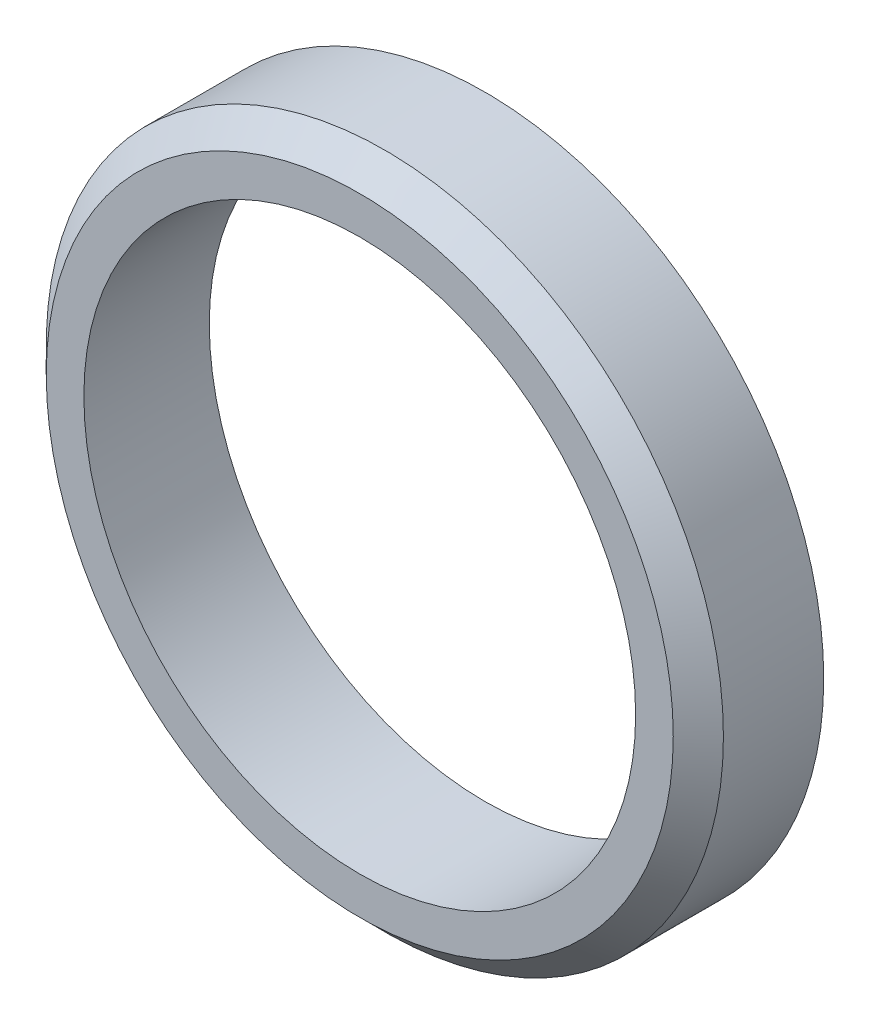
ISO-10303-21;
HEADER;
FILE_DESCRIPTION(('STEP AP214'),'2;1');
FILE_NAME('part.step','',(''),(''),'','','');
FILE_SCHEMA(('AUTOMOTIVE_DESIGN { 1 0 10303 214 1 1 1 1 }'));
ENDSEC;
DATA;
#1=APPLICATION_CONTEXT('core data for automotive mechanical design processes');
#2=APPLICATION_PROTOCOL_DEFINITION('international standard','automotive_design',2000,#1);
#3=PRODUCT_CONTEXT('',#1,'mechanical');
#4=PRODUCT('Part','Part','',(#3));
#5=PRODUCT_RELATED_PRODUCT_CATEGORY('part','',(#4));
#6=PRODUCT_DEFINITION_FORMATION('','',#4);
#7=PRODUCT_DEFINITION_CONTEXT('part definition',#1,'design');
#8=PRODUCT_DEFINITION('design','',#6,#7);
#9=PRODUCT_DEFINITION_SHAPE('','',#8);
#10=(LENGTH_UNIT() NAMED_UNIT(*) SI_UNIT(.MILLI.,.METRE.));
#11=(NAMED_UNIT(*) PLANE_ANGLE_UNIT() SI_UNIT($,.RADIAN.));
#12=(NAMED_UNIT(*) SI_UNIT($,.STERADIAN.) SOLID_ANGLE_UNIT());
#13=UNCERTAINTY_MEASURE_WITH_UNIT(LENGTH_MEASURE(1.E-05),#10,'distance_accuracy_value','');
#14=(GEOMETRIC_REPRESENTATION_CONTEXT(3) GLOBAL_UNCERTAINTY_ASSIGNED_CONTEXT((#13)) GLOBAL_UNIT_ASSIGNED_CONTEXT((#10,
#11,#12)) REPRESENTATION_CONTEXT('',''));
#15=CARTESIAN_POINT('',(0.,0.,0.));
#16=DIRECTION('',(0.,0.,1.));
#17=DIRECTION('',(1.,0.,0.));
#18=AXIS2_PLACEMENT_3D('',#15,#16,#17);
#19=CARTESIAN_POINT('',(0.,0.,25.));
#20=DIRECTION('',(0.,0.,-1.));
#21=DIRECTION('',(-1.,0.,0.));
#22=AXIS2_PLACEMENT_3D('',#19,#20,#21);
#23=CYLINDRICAL_SURFACE('',#22,67.5);
#24=CARTESIAN_POINT('',(0.,0.,20.));
#25=DIRECTION('',(0.,0.,1.));
#26=DIRECTION('',(1.,0.,0.));
#27=AXIS2_PLACEMENT_3D('',#24,#25,#26);
#28=CIRCLE('',#27,67.5);
#29=CARTESIAN_POINT('',(67.5,0.,20.));
#30=VERTEX_POINT('',#29);
#31=EDGE_CURVE('E10',#30,#30,#28,.F.);
#32=ORIENTED_EDGE('',*,*,#31,.T.);
#33=EDGE_LOOP('',(#32));
#34=FACE_BOUND('',#33,.T.);
#35=CARTESIAN_POINT('',(0.,0.,0.));
#36=DIRECTION('',(0.,0.,1.));
#37=DIRECTION('',(1.,0.,0.));
#38=AXIS2_PLACEMENT_3D('',#35,#36,#37);
#39=CIRCLE('',#38,67.5);
#40=CARTESIAN_POINT('',(67.5,0.,0.));
#41=VERTEX_POINT('',#40);
#42=EDGE_CURVE('E44',#41,#41,#39,.T.);
#43=ORIENTED_EDGE('',*,*,#42,.T.);
#44=EDGE_LOOP('',(#43));
#45=FACE_BOUND('',#44,.T.);
#46=ADVANCED_FACE('F33',(#34,#45),#23,.T.);
#47=CARTESIAN_POINT('',(0.,0.,25.));
#48=DIRECTION('',(0.,0.,1.));
#49=DIRECTION('',(1.,0.,0.));
#50=AXIS2_PLACEMENT_3D('',#47,#48,#49);
#51=PLANE('',#50);
#52=CARTESIAN_POINT('',(0.,0.,25.));
#53=DIRECTION('',(0.,0.,-1.));
#54=DIRECTION('',(-1.,0.,0.));
#55=AXIS2_PLACEMENT_3D('',#52,#53,#54);
#56=CIRCLE('',#55,55.);
#57=CARTESIAN_POINT('',(-55.,0.,25.));
#58=VERTEX_POINT('',#57);
#59=EDGE_CURVE('E48',#58,#58,#56,.T.);
#60=ORIENTED_EDGE('',*,*,#59,.T.);
#61=EDGE_LOOP('',(#60));
#62=FACE_BOUND('',#61,.T.);
#63=CARTESIAN_POINT('',(0.,0.,25.));
#64=DIRECTION('',(0.,0.,1.));
#65=DIRECTION('',(1.,0.,0.));
#66=AXIS2_PLACEMENT_3D('',#63,#64,#65);
#67=CIRCLE('',#66,62.5);
#68=CARTESIAN_POINT('',(62.5,0.,25.));
#69=VERTEX_POINT('',#68);
#70=EDGE_CURVE('E40',#69,#69,#67,.T.);
#71=ORIENTED_EDGE('',*,*,#70,.T.);
#72=EDGE_LOOP('',(#71));
#73=FACE_BOUND('',#72,.T.);
#74=ADVANCED_FACE('F57',(#62,#73),#51,.T.);
#75=CARTESIAN_POINT('',(0.,0.,0.));
#76=DIRECTION('',(0.,0.,1.));
#77=DIRECTION('',(1.,0.,0.));
#78=AXIS2_PLACEMENT_3D('',#75,#76,#77);
#79=PLANE('',#78);
#80=CARTESIAN_POINT('',(0.,0.,0.));
#81=DIRECTION('',(0.,0.,-1.));
#82=DIRECTION('',(-1.,0.,0.));
#83=AXIS2_PLACEMENT_3D('',#80,#81,#82);
#84=CIRCLE('',#83,55.);
#85=CARTESIAN_POINT('',(-55.,0.,0.));
#86=VERTEX_POINT('',#85);
#87=EDGE_CURVE('E51',#86,#86,#84,.T.);
#88=ORIENTED_EDGE('',*,*,#87,.F.);
#89=EDGE_LOOP('',(#88));
#90=FACE_BOUND('',#89,.T.);
#91=ORIENTED_EDGE('',*,*,#42,.F.);
#92=EDGE_LOOP('',(#91));
#93=FACE_BOUND('',#92,.T.);
#94=ADVANCED_FACE('F65',(#90,#93),#79,.F.);
#95=CARTESIAN_POINT('',(0.,0.,25.));
#96=DIRECTION('',(0.,0.,-1.));
#97=DIRECTION('',(-1.,0.,0.));
#98=AXIS2_PLACEMENT_3D('',#95,#96,#97);
#99=CONICAL_SURFACE('',#98,62.5,0.785398163397447);
#100=ORIENTED_EDGE('',*,*,#31,.F.);
#101=EDGE_LOOP('',(#100));
#102=FACE_BOUND('',#101,.T.);
#103=ORIENTED_EDGE('',*,*,#70,.F.);
#104=EDGE_LOOP('',(#103));
#105=FACE_BOUND('',#104,.T.);
#106=ADVANCED_FACE('F35',(#102,#105),#99,.T.);
#107=CARTESIAN_POINT('',(0.,0.,25.));
#108=DIRECTION('',(0.,0.,-1.));
#109=DIRECTION('',(-1.,0.,0.));
#110=AXIS2_PLACEMENT_3D('',#107,#108,#109);
#111=CYLINDRICAL_SURFACE('',#110,55.);
#112=ORIENTED_EDGE('',*,*,#59,.F.);
#113=EDGE_LOOP('',(#112));
#114=FACE_BOUND('',#113,.T.);
#115=ORIENTED_EDGE('',*,*,#87,.T.);
#116=EDGE_LOOP('',(#115));
#117=FACE_BOUND('',#116,.T.);
#118=ADVANCED_FACE('F59',(#114,#117),#111,.F.);
#119=CLOSED_SHELL('',(#46,#74,#94,#106,#118));
#120=MANIFOLD_SOLID_BREP('B2',#119);
#121=ADVANCED_BREP_SHAPE_REPRESENTATION('',(#18,#120),#14);
#122=SHAPE_DEFINITION_REPRESENTATION(#9,#121);
ENDSEC;
END-ISO-10303-21;
